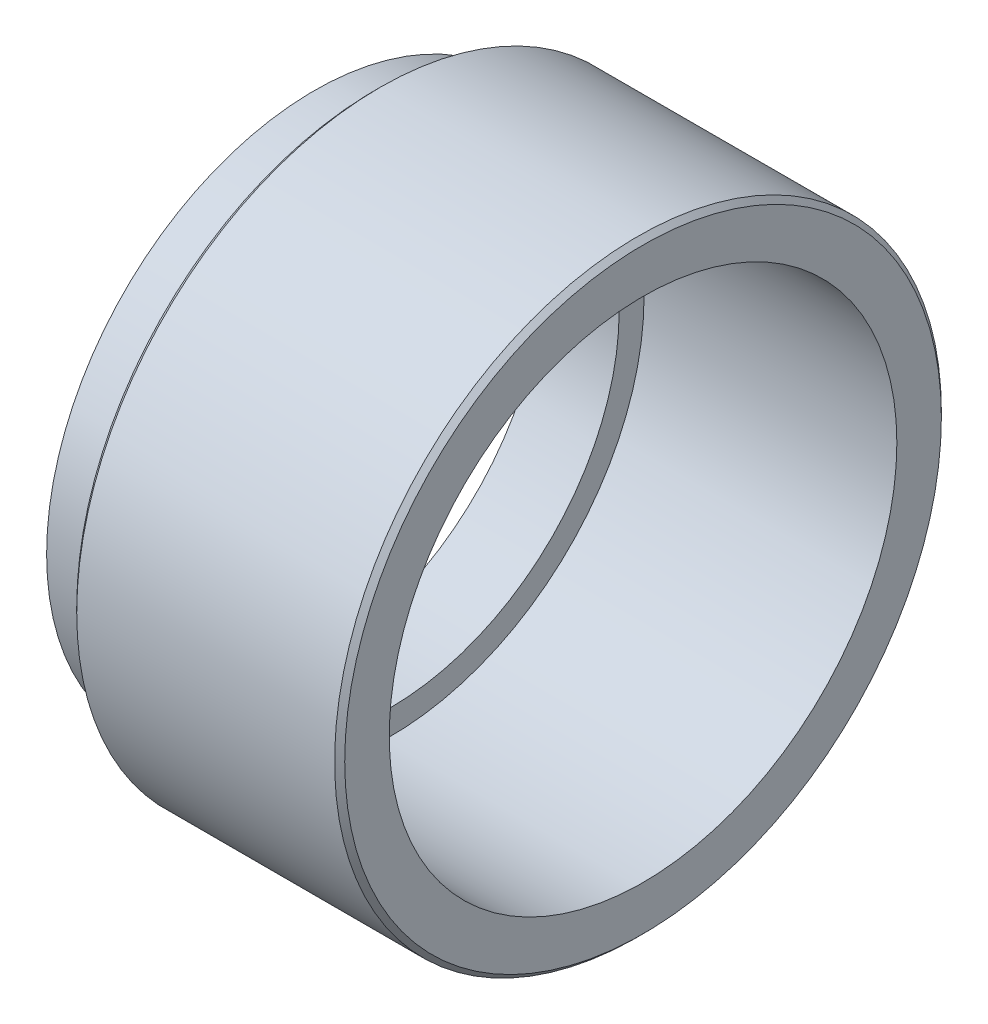
ISO-10303-21;
HEADER;
FILE_DESCRIPTION(('STEP AP214'),'2;1');
FILE_NAME('part.step','',(''),(''),'','','');
FILE_SCHEMA(('AUTOMOTIVE_DESIGN { 1 0 10303 214 1 1 1 1 }'));
ENDSEC;
DATA;
#1=APPLICATION_CONTEXT('core data for automotive mechanical design processes');
#2=APPLICATION_PROTOCOL_DEFINITION('international standard','automotive_design',2000,#1);
#3=PRODUCT_CONTEXT('',#1,'mechanical');
#4=PRODUCT('Part','Part','',(#3));
#5=PRODUCT_RELATED_PRODUCT_CATEGORY('part','',(#4));
#6=PRODUCT_DEFINITION_FORMATION('','',#4);
#7=PRODUCT_DEFINITION_CONTEXT('part definition',#1,'design');
#8=PRODUCT_DEFINITION('design','',#6,#7);
#9=PRODUCT_DEFINITION_SHAPE('','',#8);
#10=(LENGTH_UNIT() NAMED_UNIT(*) SI_UNIT(.MILLI.,.METRE.));
#11=(NAMED_UNIT(*) PLANE_ANGLE_UNIT() SI_UNIT($,.RADIAN.));
#12=(NAMED_UNIT(*) SI_UNIT($,.STERADIAN.) SOLID_ANGLE_UNIT());
#13=UNCERTAINTY_MEASURE_WITH_UNIT(LENGTH_MEASURE(1.E-05),#10,'distance_accuracy_value','');
#14=(GEOMETRIC_REPRESENTATION_CONTEXT(3) GLOBAL_UNCERTAINTY_ASSIGNED_CONTEXT((#13)) GLOBAL_UNIT_ASSIGNED_CONTEXT((#10,
#11,#12)) REPRESENTATION_CONTEXT('',''));
#15=CARTESIAN_POINT('',(0.,0.,0.));
#16=DIRECTION('',(0.,0.,1.));
#17=DIRECTION('',(1.,0.,0.));
#18=AXIS2_PLACEMENT_3D('',#15,#16,#17);
#19=CARTESIAN_POINT('',(-12.7,12.0015,0.));
#20=DIRECTION('',(1.,0.,0.));
#21=DIRECTION('',(0.,0.,-1.));
#22=AXIS2_PLACEMENT_3D('',#19,#20,#21);
#23=PLANE('',#22);
#24=CARTESIAN_POINT('',(-12.7,0.,0.));
#25=DIRECTION('',(1.,0.,0.));
#26=DIRECTION('',(0.,0.,-1.));
#27=AXIS2_PLACEMENT_3D('',#24,#25,#26);
#28=CIRCLE('',#27,12.75);
#29=CARTESIAN_POINT('',(-12.7,0.,-12.75));
#30=VERTEX_POINT('',#29);
#31=EDGE_CURVE('E66',#30,#30,#28,.F.);
#32=ORIENTED_EDGE('',*,*,#31,.F.);
#33=EDGE_LOOP('',(#32));
#34=FACE_BOUND('',#33,.T.);
#35=CARTESIAN_POINT('',(-12.7,0.,0.));
#36=DIRECTION('',(1.,0.,0.));
#37=DIRECTION('',(0.,0.,-1.));
#38=AXIS2_PLACEMENT_3D('',#35,#36,#37);
#39=CIRCLE('',#38,11.5);
#40=CARTESIAN_POINT('',(-12.7,0.,-11.5));
#41=VERTEX_POINT('',#40);
#42=EDGE_CURVE('E72',#41,#41,#39,.T.);
#43=ORIENTED_EDGE('',*,*,#42,.F.);
#44=EDGE_LOOP('',(#43));
#45=FACE_BOUND('',#44,.T.);
#46=ADVANCED_FACE('F37',(#34,#45),#23,.T.);
#47=CARTESIAN_POINT('',(0.,15.24,0.));
#48=DIRECTION('',(1.,0.,0.));
#49=DIRECTION('',(0.,0.,-1.));
#50=AXIS2_PLACEMENT_3D('',#47,#48,#49);
#51=PLANE('',#50);
#52=CARTESIAN_POINT('',(0.,0.,0.));
#53=DIRECTION('',(1.,0.,0.));
#54=DIRECTION('',(0.,0.,-1.));
#55=AXIS2_PLACEMENT_3D('',#52,#53,#54);
#56=CIRCLE('',#55,14.986);
#57=CARTESIAN_POINT('',(0.,0.,-14.986));
#58=VERTEX_POINT('',#57);
#59=EDGE_CURVE('E57',#58,#58,#56,.T.);
#60=ORIENTED_EDGE('',*,*,#59,.T.);
#61=EDGE_LOOP('',(#60));
#62=FACE_BOUND('',#61,.T.);
#63=CARTESIAN_POINT('',(0.,0.,0.));
#64=DIRECTION('',(1.,0.,0.));
#65=DIRECTION('',(0.,0.,-1.));
#66=AXIS2_PLACEMENT_3D('',#63,#64,#65);
#67=CIRCLE('',#66,12.75);
#68=CARTESIAN_POINT('',(0.,0.,-12.75));
#69=VERTEX_POINT('',#68);
#70=EDGE_CURVE('E69',#69,#69,#67,.T.);
#71=ORIENTED_EDGE('',*,*,#70,.F.);
#72=EDGE_LOOP('',(#71));
#73=FACE_BOUND('',#72,.T.);
#74=ADVANCED_FACE('F79',(#62,#73),#51,.T.);
#75=CARTESIAN_POINT('',(0.,0.,0.));
#76=DIRECTION('',(1.,0.,0.));
#77=DIRECTION('',(0.,0.,-1.));
#78=AXIS2_PLACEMENT_3D('',#75,#76,#77);
#79=CYLINDRICAL_SURFACE('',#78,15.24);
#80=CARTESIAN_POINT('',(-0.253999999999994,0.,0.));
#81=DIRECTION('',(1.,0.,0.));
#82=DIRECTION('',(0.,0.,-1.));
#83=AXIS2_PLACEMENT_3D('',#80,#81,#82);
#84=CIRCLE('',#83,15.24);
#85=CARTESIAN_POINT('',(-0.253999999999994,0.,-15.24));
#86=VERTEX_POINT('',#85);
#87=EDGE_CURVE('E48',#86,#86,#84,.F.);
#88=ORIENTED_EDGE('',*,*,#87,.T.);
#89=EDGE_LOOP('',(#88));
#90=FACE_BOUND('',#89,.T.);
#91=CARTESIAN_POINT('',(-13.208,0.,0.));
#92=DIRECTION('',(-1.,0.,0.));
#93=DIRECTION('',(0.,0.,1.));
#94=AXIS2_PLACEMENT_3D('',#91,#92,#93);
#95=CIRCLE('',#94,15.24);
#96=CARTESIAN_POINT('',(-13.208,0.,15.24));
#97=VERTEX_POINT('',#96);
#98=EDGE_CURVE('E52',#97,#97,#95,.F.);
#99=ORIENTED_EDGE('',*,*,#98,.T.);
#100=EDGE_LOOP('',(#99));
#101=FACE_BOUND('',#100,.T.);
#102=ADVANCED_FACE('F86',(#90,#101),#79,.T.);
#103=CARTESIAN_POINT('',(0.,0.,0.));
#104=DIRECTION('',(-1.,0.,0.));
#105=DIRECTION('',(0.,0.,1.));
#106=AXIS2_PLACEMENT_3D('',#103,#104,#105);
#107=CONICAL_SURFACE('',#106,14.986,0.785398163397442);
#108=ORIENTED_EDGE('',*,*,#87,.F.);
#109=EDGE_LOOP('',(#108));
#110=FACE_BOUND('',#109,.T.);
#111=ORIENTED_EDGE('',*,*,#59,.F.);
#112=EDGE_LOOP('',(#111));
#113=FACE_BOUND('',#112,.T.);
#114=ADVANCED_FACE('F103',(#110,#113),#107,.T.);
#115=CARTESIAN_POINT('',(-13.208,0.,0.));
#116=DIRECTION('',(1.,0.,0.));
#117=DIRECTION('',(0.,0.,-1.));
#118=AXIS2_PLACEMENT_3D('',#115,#116,#117);
#119=CONICAL_SURFACE('',#118,15.24,0.785398163397445);
#120=CARTESIAN_POINT('',(-13.462,0.,0.));
#121=DIRECTION('',(-1.,0.,0.));
#122=DIRECTION('',(0.,0.,1.));
#123=AXIS2_PLACEMENT_3D('',#120,#121,#122);
#124=CIRCLE('',#123,14.986);
#125=CARTESIAN_POINT('',(-13.462,0.,14.986));
#126=VERTEX_POINT('',#125);
#127=EDGE_CURVE('E44',#126,#126,#124,.T.);
#128=ORIENTED_EDGE('',*,*,#127,.F.);
#129=EDGE_LOOP('',(#128));
#130=FACE_BOUND('',#129,.T.);
#131=ORIENTED_EDGE('',*,*,#98,.F.);
#132=EDGE_LOOP('',(#131));
#133=FACE_BOUND('',#132,.T.);
#134=ADVANCED_FACE('F39',(#130,#133),#119,.T.);
#135=CARTESIAN_POINT('',(-13.462,15.24,0.));
#136=DIRECTION('',(-1.,0.,0.));
#137=DIRECTION('',(0.,0.,1.));
#138=AXIS2_PLACEMENT_3D('',#135,#136,#137);
#139=PLANE('',#138);
#140=CARTESIAN_POINT('',(-13.462,0.,0.));
#141=DIRECTION('',(-1.,0.,0.));
#142=DIRECTION('',(0.,0.,1.));
#143=AXIS2_PLACEMENT_3D('',#140,#141,#142);
#144=CIRCLE('',#143,13.45);
#145=CARTESIAN_POINT('',(-13.462,0.,13.45));
#146=VERTEX_POINT('',#145);
#147=EDGE_CURVE('E10',#146,#146,#144,.T.);
#148=ORIENTED_EDGE('',*,*,#147,.F.);
#149=EDGE_LOOP('',(#148));
#150=FACE_BOUND('',#149,.T.);
#151=ORIENTED_EDGE('',*,*,#127,.T.);
#152=EDGE_LOOP('',(#151));
#153=FACE_BOUND('',#152,.T.);
#154=ADVANCED_FACE('F98',(#150,#153),#139,.T.);
#155=CARTESIAN_POINT('',(24.5803448278363,0.,0.));
#156=DIRECTION('',(-1.,0.,0.));
#157=DIRECTION('',(0.,0.,1.));
#158=AXIS2_PLACEMENT_3D('',#155,#156,#157);
#159=CYLINDRICAL_SURFACE('',#158,13.45);
#160=ORIENTED_EDGE('',*,*,#147,.T.);
#161=EDGE_LOOP('',(#160));
#162=FACE_BOUND('',#161,.T.);
#163=CARTESIAN_POINT('',(-16.51,0.,0.));
#164=DIRECTION('',(-1.,0.,0.));
#165=DIRECTION('',(0.,0.,1.));
#166=AXIS2_PLACEMENT_3D('',#163,#164,#165);
#167=CIRCLE('',#166,13.45);
#168=CARTESIAN_POINT('',(-16.51,0.,13.45));
#169=VERTEX_POINT('',#168);
#170=EDGE_CURVE('E60',#169,#169,#167,.T.);
#171=ORIENTED_EDGE('',*,*,#170,.F.);
#172=EDGE_LOOP('',(#171));
#173=FACE_BOUND('',#172,.T.);
#174=ADVANCED_FACE('F92',(#162,#173),#159,.T.);
#175=CARTESIAN_POINT('',(-16.51,13.1445,0.));
#176=DIRECTION('',(-1.,0.,0.));
#177=DIRECTION('',(0.,0.,1.));
#178=AXIS2_PLACEMENT_3D('',#175,#176,#177);
#179=PLANE('',#178);
#180=CARTESIAN_POINT('',(-16.51,0.,0.));
#181=DIRECTION('',(-1.,0.,0.));
#182=DIRECTION('',(0.,0.,1.));
#183=AXIS2_PLACEMENT_3D('',#180,#181,#182);
#184=CIRCLE('',#183,11.5);
#185=CARTESIAN_POINT('',(-16.51,0.,11.5));
#186=VERTEX_POINT('',#185);
#187=EDGE_CURVE('E63',#186,#186,#184,.T.);
#188=ORIENTED_EDGE('',*,*,#187,.F.);
#189=EDGE_LOOP('',(#188));
#190=FACE_BOUND('',#189,.T.);
#191=ORIENTED_EDGE('',*,*,#170,.T.);
#192=EDGE_LOOP('',(#191));
#193=FACE_BOUND('',#192,.T.);
#194=ADVANCED_FACE('F94',(#190,#193),#179,.T.);
#195=CARTESIAN_POINT('',(24.5803448278363,0.,0.));
#196=DIRECTION('',(-1.,0.,0.));
#197=DIRECTION('',(0.,0.,1.));
#198=AXIS2_PLACEMENT_3D('',#195,#196,#197);
#199=CYLINDRICAL_SURFACE('',#198,11.5);
#200=ORIENTED_EDGE('',*,*,#187,.T.);
#201=EDGE_LOOP('',(#200));
#202=FACE_BOUND('',#201,.T.);
#203=ORIENTED_EDGE('',*,*,#42,.T.);
#204=EDGE_LOOP('',(#203));
#205=FACE_BOUND('',#204,.T.);
#206=ADVANCED_FACE('F76',(#202,#205),#199,.F.);
#207=CARTESIAN_POINT('',(-55.0868088914464,0.,0.));
#208=DIRECTION('',(1.,0.,0.));
#209=DIRECTION('',(0.,0.,-1.));
#210=AXIS2_PLACEMENT_3D('',#207,#208,#209);
#211=CYLINDRICAL_SURFACE('',#210,12.75);
#212=ORIENTED_EDGE('',*,*,#31,.T.);
#213=EDGE_LOOP('',(#212));
#214=FACE_BOUND('',#213,.T.);
#215=ORIENTED_EDGE('',*,*,#70,.T.);
#216=EDGE_LOOP('',(#215));
#217=FACE_BOUND('',#216,.T.);
#218=ADVANCED_FACE('F117',(#214,#217),#211,.F.);
#219=CLOSED_SHELL('',(#46,#74,#102,#114,#134,#154,#174,#194,#206,#218));
#220=MANIFOLD_SOLID_BREP('B2',#219);
#221=ADVANCED_BREP_SHAPE_REPRESENTATION('',(#18,#220),#14);
#222=SHAPE_DEFINITION_REPRESENTATION(#9,#221);
ENDSEC;
END-ISO-10303-21;
